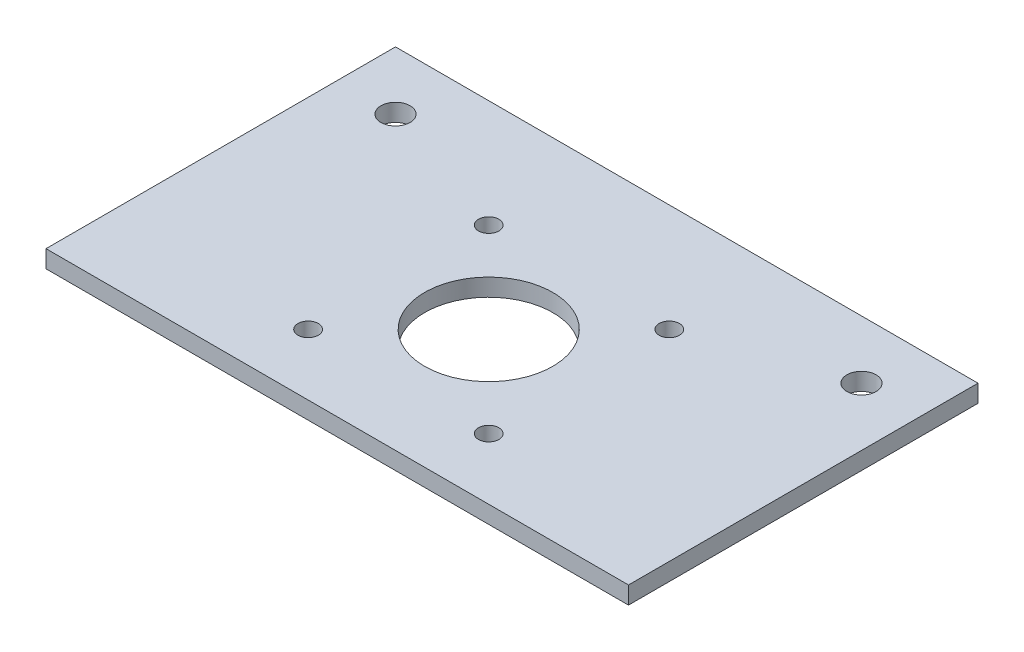
ISO-10303-21;
HEADER;
FILE_DESCRIPTION(('STEP AP214'),'2;1');
FILE_NAME('part.step','',(''),(''),'','','');
FILE_SCHEMA(('AUTOMOTIVE_DESIGN { 1 0 10303 214 1 1 1 1 }'));
ENDSEC;
DATA;
#1=APPLICATION_CONTEXT('core data for automotive mechanical design processes');
#2=APPLICATION_PROTOCOL_DEFINITION('international standard','automotive_design',2000,#1);
#3=PRODUCT_CONTEXT('',#1,'mechanical');
#4=PRODUCT('Part','Part','',(#3));
#5=PRODUCT_RELATED_PRODUCT_CATEGORY('part','',(#4));
#6=PRODUCT_DEFINITION_FORMATION('','',#4);
#7=PRODUCT_DEFINITION_CONTEXT('part definition',#1,'design');
#8=PRODUCT_DEFINITION('design','',#6,#7);
#9=PRODUCT_DEFINITION_SHAPE('','',#8);
#10=(LENGTH_UNIT() NAMED_UNIT(*) SI_UNIT(.MILLI.,.METRE.));
#11=(NAMED_UNIT(*) PLANE_ANGLE_UNIT() SI_UNIT($,.RADIAN.));
#12=(NAMED_UNIT(*) SI_UNIT($,.STERADIAN.) SOLID_ANGLE_UNIT());
#13=UNCERTAINTY_MEASURE_WITH_UNIT(LENGTH_MEASURE(1.E-05),#10,'distance_accuracy_value','');
#14=(GEOMETRIC_REPRESENTATION_CONTEXT(3) GLOBAL_UNCERTAINTY_ASSIGNED_CONTEXT((#13)) GLOBAL_UNIT_ASSIGNED_CONTEXT((#10,
#11,#12)) REPRESENTATION_CONTEXT('',''));
#15=CARTESIAN_POINT('',(0.,0.,0.));
#16=DIRECTION('',(0.,0.,1.));
#17=DIRECTION('',(1.,0.,0.));
#18=AXIS2_PLACEMENT_3D('',#15,#16,#17);
#19=CARTESIAN_POINT('',(50.,-3.,30.));
#20=DIRECTION('',(1.,0.,0.));
#21=DIRECTION('',(0.,0.,-1.));
#22=AXIS2_PLACEMENT_3D('',#19,#20,#21);
#23=PLANE('',#22);
#24=DIRECTION('',(0.,0.,-1.));
#25=VECTOR('',#24,1.);
#26=CARTESIAN_POINT('',(50.,0.,30.));
#27=LINE('',#26,#25);
#28=CARTESIAN_POINT('',(50.,0.,30.));
#29=VERTEX_POINT('',#28);
#30=CARTESIAN_POINT('',(50.,0.,-30.));
#31=VERTEX_POINT('',#30);
#32=EDGE_CURVE('E104',#29,#31,#27,.T.);
#33=ORIENTED_EDGE('',*,*,#32,.F.);
#34=DIRECTION('',(0.,1.,0.));
#35=VECTOR('',#34,1.);
#36=CARTESIAN_POINT('',(50.,-3.,30.));
#37=LINE('',#36,#35);
#38=CARTESIAN_POINT('',(50.,-3.,30.));
#39=VERTEX_POINT('',#38);
#40=EDGE_CURVE('E11',#39,#29,#37,.T.);
#41=ORIENTED_EDGE('',*,*,#40,.F.);
#42=DIRECTION('',(0.,0.,-1.));
#43=VECTOR('',#42,1.);
#44=CARTESIAN_POINT('',(50.,-3.,30.));
#45=LINE('',#44,#43);
#46=CARTESIAN_POINT('',(50.,-3.,-30.));
#47=VERTEX_POINT('',#46);
#48=EDGE_CURVE('E97',#39,#47,#45,.T.);
#49=ORIENTED_EDGE('',*,*,#48,.T.);
#50=DIRECTION('',(0.,1.,0.));
#51=VECTOR('',#50,1.);
#52=CARTESIAN_POINT('',(50.,-3.,-30.));
#53=LINE('',#52,#51);
#54=EDGE_CURVE('E42',#47,#31,#53,.T.);
#55=ORIENTED_EDGE('',*,*,#54,.T.);
#56=EDGE_LOOP('',(#33,#41,#49,#55));
#57=FACE_BOUND('',#56,.T.);
#58=ADVANCED_FACE('F39',(#57),#23,.T.);
#59=CARTESIAN_POINT('',(-50.,-3.,30.));
#60=DIRECTION('',(0.,0.,1.));
#61=DIRECTION('',(1.,0.,0.));
#62=AXIS2_PLACEMENT_3D('',#59,#60,#61);
#63=PLANE('',#62);
#64=DIRECTION('',(1.,0.,0.));
#65=VECTOR('',#64,1.);
#66=CARTESIAN_POINT('',(-50.,0.,30.));
#67=LINE('',#66,#65);
#68=CARTESIAN_POINT('',(-50.,0.,30.));
#69=VERTEX_POINT('',#68);
#70=EDGE_CURVE('E99',#69,#29,#67,.T.);
#71=ORIENTED_EDGE('',*,*,#70,.F.);
#72=DIRECTION('',(0.,1.,0.));
#73=VECTOR('',#72,1.);
#74=CARTESIAN_POINT('',(-50.,-3.,30.));
#75=LINE('',#74,#73);
#76=CARTESIAN_POINT('',(-50.,-3.,30.));
#77=VERTEX_POINT('',#76);
#78=EDGE_CURVE('E48',#77,#69,#75,.T.);
#79=ORIENTED_EDGE('',*,*,#78,.F.);
#80=DIRECTION('',(1.,0.,0.));
#81=VECTOR('',#80,1.);
#82=CARTESIAN_POINT('',(-50.,-3.,30.));
#83=LINE('',#82,#81);
#84=EDGE_CURVE('E94',#77,#39,#83,.T.);
#85=ORIENTED_EDGE('',*,*,#84,.T.);
#86=ORIENTED_EDGE('',*,*,#40,.T.);
#87=EDGE_LOOP('',(#71,#79,#85,#86));
#88=FACE_BOUND('',#87,.T.);
#89=ADVANCED_FACE('F115',(#88),#63,.T.);
#90=CARTESIAN_POINT('',(-50.,-3.,30.));
#91=DIRECTION('',(-1.,0.,0.));
#92=DIRECTION('',(0.,0.,1.));
#93=AXIS2_PLACEMENT_3D('',#90,#91,#92);
#94=PLANE('',#93);
#95=DIRECTION('',(0.,0.,1.));
#96=VECTOR('',#95,1.);
#97=CARTESIAN_POINT('',(-50.,0.,30.));
#98=LINE('',#97,#96);
#99=CARTESIAN_POINT('',(-50.,0.,-30.));
#100=VERTEX_POINT('',#99);
#101=EDGE_CURVE('E89',#100,#69,#98,.T.);
#102=ORIENTED_EDGE('',*,*,#101,.F.);
#103=DIRECTION('',(0.,1.,0.));
#104=VECTOR('',#103,1.);
#105=CARTESIAN_POINT('',(-50.,-3.,-30.));
#106=LINE('',#105,#104);
#107=CARTESIAN_POINT('',(-50.,-3.,-30.));
#108=VERTEX_POINT('',#107);
#109=EDGE_CURVE('E84',#108,#100,#106,.T.);
#110=ORIENTED_EDGE('',*,*,#109,.F.);
#111=DIRECTION('',(0.,0.,1.));
#112=VECTOR('',#111,1.);
#113=CARTESIAN_POINT('',(-50.,-3.,30.));
#114=LINE('',#113,#112);
#115=EDGE_CURVE('E87',#108,#77,#114,.T.);
#116=ORIENTED_EDGE('',*,*,#115,.T.);
#117=ORIENTED_EDGE('',*,*,#78,.T.);
#118=EDGE_LOOP('',(#102,#110,#116,#117));
#119=FACE_BOUND('',#118,.T.);
#120=ADVANCED_FACE('F86',(#119),#94,.T.);
#121=CARTESIAN_POINT('',(-50.,-3.,-30.));
#122=DIRECTION('',(0.,0.,-1.));
#123=DIRECTION('',(-1.,0.,0.));
#124=AXIS2_PLACEMENT_3D('',#121,#122,#123);
#125=PLANE('',#124);
#126=DIRECTION('',(-1.,0.,0.));
#127=VECTOR('',#126,1.);
#128=CARTESIAN_POINT('',(-50.,0.,-30.));
#129=LINE('',#128,#127);
#130=EDGE_CURVE('E107',#31,#100,#129,.T.);
#131=ORIENTED_EDGE('',*,*,#130,.F.);
#132=ORIENTED_EDGE('',*,*,#54,.F.);
#133=DIRECTION('',(-1.,0.,0.));
#134=VECTOR('',#133,1.);
#135=CARTESIAN_POINT('',(-50.,-3.,-30.));
#136=LINE('',#135,#134);
#137=EDGE_CURVE('E93',#47,#108,#136,.T.);
#138=ORIENTED_EDGE('',*,*,#137,.T.);
#139=ORIENTED_EDGE('',*,*,#109,.T.);
#140=EDGE_LOOP('',(#131,#132,#138,#139));
#141=FACE_BOUND('',#140,.T.);
#142=ADVANCED_FACE('F96',(#141),#125,.T.);
#143=CARTESIAN_POINT('',(0.,-3.,0.));
#144=DIRECTION('',(0.,-1.,0.));
#145=DIRECTION('',(0.,0.,-1.));
#146=AXIS2_PLACEMENT_3D('',#143,#144,#145);
#147=PLANE('',#146);
#148=CARTESIAN_POINT('',(40.,-3.,-20.));
#149=DIRECTION('',(0.,1.,0.));
#150=DIRECTION('',(0.,0.,1.));
#151=AXIS2_PLACEMENT_3D('',#148,#149,#150);
#152=CIRCLE('',#151,2.5);
#153=CARTESIAN_POINT('',(40.,-3.,-17.5));
#154=VERTEX_POINT('',#153);
#155=EDGE_CURVE('E108',#154,#154,#152,.T.);
#156=ORIENTED_EDGE('',*,*,#155,.T.);
#157=EDGE_LOOP('',(#156));
#158=FACE_BOUND('',#157,.T.);
#159=CARTESIAN_POINT('',(-15.5,-3.,-11.5));
#160=DIRECTION('',(0.,1.,0.));
#161=DIRECTION('',(0.,0.,-1.));
#162=AXIS2_PLACEMENT_3D('',#159,#160,#161);
#163=CIRCLE('',#162,1.75);
#164=CARTESIAN_POINT('',(-15.5,-3.,-13.25));
#165=VERTEX_POINT('',#164);
#166=EDGE_CURVE('E185',#165,#165,#163,.T.);
#167=ORIENTED_EDGE('',*,*,#166,.T.);
#168=EDGE_LOOP('',(#167));
#169=FACE_BOUND('',#168,.T.);
#170=CARTESIAN_POINT('',(-15.5,-3.,19.5));
#171=DIRECTION('',(0.,1.,0.));
#172=DIRECTION('',(0.,0.,1.));
#173=AXIS2_PLACEMENT_3D('',#170,#171,#172);
#174=CIRCLE('',#173,1.75000000000006);
#175=CARTESIAN_POINT('',(-15.5,-3.,21.2500000000001));
#176=VERTEX_POINT('',#175);
#177=EDGE_CURVE('E178',#176,#176,#174,.T.);
#178=ORIENTED_EDGE('',*,*,#177,.T.);
#179=EDGE_LOOP('',(#178));
#180=FACE_BOUND('',#179,.T.);
#181=CARTESIAN_POINT('',(15.5,-3.,19.5));
#182=DIRECTION('',(0.,1.,0.));
#183=DIRECTION('',(0.,0.,-1.));
#184=AXIS2_PLACEMENT_3D('',#181,#182,#183);
#185=CIRCLE('',#184,1.75);
#186=CARTESIAN_POINT('',(15.5,-3.,17.75));
#187=VERTEX_POINT('',#186);
#188=EDGE_CURVE('E205',#187,#187,#185,.T.);
#189=ORIENTED_EDGE('',*,*,#188,.T.);
#190=EDGE_LOOP('',(#189));
#191=FACE_BOUND('',#190,.T.);
#192=CARTESIAN_POINT('',(15.5,-3.,-11.5));
#193=DIRECTION('',(0.,1.,0.));
#194=DIRECTION('',(0.,0.,1.));
#195=AXIS2_PLACEMENT_3D('',#192,#193,#194);
#196=CIRCLE('',#195,1.75);
#197=CARTESIAN_POINT('',(15.5,-3.,-9.74999999999999));
#198=VERTEX_POINT('',#197);
#199=EDGE_CURVE('E199',#198,#198,#196,.T.);
#200=ORIENTED_EDGE('',*,*,#199,.T.);
#201=EDGE_LOOP('',(#200));
#202=FACE_BOUND('',#201,.T.);
#203=CARTESIAN_POINT('',(0.,-3.,4.00000000000001));
#204=DIRECTION('',(0.,1.,0.));
#205=DIRECTION('',(0.,0.,1.));
#206=AXIS2_PLACEMENT_3D('',#203,#204,#205);
#207=CIRCLE('',#206,11.);
#208=CARTESIAN_POINT('',(0.,-3.,15.));
#209=VERTEX_POINT('',#208);
#210=EDGE_CURVE('E193',#209,#209,#207,.T.);
#211=ORIENTED_EDGE('',*,*,#210,.T.);
#212=EDGE_LOOP('',(#211));
#213=FACE_BOUND('',#212,.T.);
#214=CARTESIAN_POINT('',(-40.,-3.,-20.));
#215=DIRECTION('',(0.,1.,0.));
#216=DIRECTION('',(0.,0.,-1.));
#217=AXIS2_PLACEMENT_3D('',#214,#215,#216);
#218=CIRCLE('',#217,2.5);
#219=CARTESIAN_POINT('',(-40.,-3.,-22.5));
#220=VERTEX_POINT('',#219);
#221=EDGE_CURVE('E171',#220,#220,#218,.T.);
#222=ORIENTED_EDGE('',*,*,#221,.T.);
#223=EDGE_LOOP('',(#222));
#224=FACE_BOUND('',#223,.T.);
#225=ORIENTED_EDGE('',*,*,#48,.F.);
#226=ORIENTED_EDGE('',*,*,#84,.F.);
#227=ORIENTED_EDGE('',*,*,#115,.F.);
#228=ORIENTED_EDGE('',*,*,#137,.F.);
#229=EDGE_LOOP('',(#225,#226,#227,#228));
#230=FACE_BOUND('',#229,.T.);
#231=ADVANCED_FACE('F92',(#158,#169,#180,#191,#202,#213,#224,#230),#147,.T.);
#232=CARTESIAN_POINT('',(0.,0.,0.));
#233=DIRECTION('',(0.,-1.,0.));
#234=DIRECTION('',(0.,0.,-1.));
#235=AXIS2_PLACEMENT_3D('',#232,#233,#234);
#236=PLANE('',#235);
#237=CARTESIAN_POINT('',(40.,0.,-20.));
#238=DIRECTION('',(0.,1.,0.));
#239=DIRECTION('',(0.,0.,1.));
#240=AXIS2_PLACEMENT_3D('',#237,#238,#239);
#241=CIRCLE('',#240,2.5);
#242=CARTESIAN_POINT('',(40.,0.,-17.5));
#243=VERTEX_POINT('',#242);
#244=EDGE_CURVE('E170',#243,#243,#241,.T.);
#245=ORIENTED_EDGE('',*,*,#244,.F.);
#246=EDGE_LOOP('',(#245));
#247=FACE_BOUND('',#246,.T.);
#248=CARTESIAN_POINT('',(-15.5,0.,-11.5));
#249=DIRECTION('',(0.,1.,0.));
#250=DIRECTION('',(0.,0.,-1.));
#251=AXIS2_PLACEMENT_3D('',#248,#249,#250);
#252=CIRCLE('',#251,1.75);
#253=CARTESIAN_POINT('',(-15.5,0.,-13.25));
#254=VERTEX_POINT('',#253);
#255=EDGE_CURVE('E188',#254,#254,#252,.T.);
#256=ORIENTED_EDGE('',*,*,#255,.F.);
#257=EDGE_LOOP('',(#256));
#258=FACE_BOUND('',#257,.T.);
#259=CARTESIAN_POINT('',(-15.5,0.,19.5));
#260=DIRECTION('',(0.,1.,0.));
#261=DIRECTION('',(0.,0.,1.));
#262=AXIS2_PLACEMENT_3D('',#259,#260,#261);
#263=CIRCLE('',#262,1.75000000000006);
#264=CARTESIAN_POINT('',(-15.5,0.,21.2500000000001));
#265=VERTEX_POINT('',#264);
#266=EDGE_CURVE('E182',#265,#265,#263,.T.);
#267=ORIENTED_EDGE('',*,*,#266,.F.);
#268=EDGE_LOOP('',(#267));
#269=FACE_BOUND('',#268,.T.);
#270=CARTESIAN_POINT('',(15.5,0.,19.5));
#271=DIRECTION('',(0.,1.,0.));
#272=DIRECTION('',(0.,0.,-1.));
#273=AXIS2_PLACEMENT_3D('',#270,#271,#272);
#274=CIRCLE('',#273,1.75);
#275=CARTESIAN_POINT('',(15.5,0.,17.75));
#276=VERTEX_POINT('',#275);
#277=EDGE_CURVE('E181',#276,#276,#274,.T.);
#278=ORIENTED_EDGE('',*,*,#277,.F.);
#279=EDGE_LOOP('',(#278));
#280=FACE_BOUND('',#279,.T.);
#281=CARTESIAN_POINT('',(15.5,0.,-11.5));
#282=DIRECTION('',(0.,1.,0.));
#283=DIRECTION('',(0.,0.,1.));
#284=AXIS2_PLACEMENT_3D('',#281,#282,#283);
#285=CIRCLE('',#284,1.75);
#286=CARTESIAN_POINT('',(15.5,0.,-9.74999999999999));
#287=VERTEX_POINT('',#286);
#288=EDGE_CURVE('E202',#287,#287,#285,.T.);
#289=ORIENTED_EDGE('',*,*,#288,.F.);
#290=EDGE_LOOP('',(#289));
#291=FACE_BOUND('',#290,.T.);
#292=CARTESIAN_POINT('',(0.,0.,4.00000000000001));
#293=DIRECTION('',(0.,1.,0.));
#294=DIRECTION('',(0.,0.,1.));
#295=AXIS2_PLACEMENT_3D('',#292,#293,#294);
#296=CIRCLE('',#295,11.);
#297=CARTESIAN_POINT('',(0.,0.,15.));
#298=VERTEX_POINT('',#297);
#299=EDGE_CURVE('E196',#298,#298,#296,.T.);
#300=ORIENTED_EDGE('',*,*,#299,.F.);
#301=EDGE_LOOP('',(#300));
#302=FACE_BOUND('',#301,.T.);
#303=CARTESIAN_POINT('',(-40.,0.,-20.));
#304=DIRECTION('',(0.,1.,0.));
#305=DIRECTION('',(0.,0.,-1.));
#306=AXIS2_PLACEMENT_3D('',#303,#304,#305);
#307=CIRCLE('',#306,2.5);
#308=CARTESIAN_POINT('',(-40.,0.,-22.5));
#309=VERTEX_POINT('',#308);
#310=EDGE_CURVE('E175',#309,#309,#307,.T.);
#311=ORIENTED_EDGE('',*,*,#310,.F.);
#312=EDGE_LOOP('',(#311));
#313=FACE_BOUND('',#312,.T.);
#314=ORIENTED_EDGE('',*,*,#32,.T.);
#315=ORIENTED_EDGE('',*,*,#130,.T.);
#316=ORIENTED_EDGE('',*,*,#101,.T.);
#317=ORIENTED_EDGE('',*,*,#70,.T.);
#318=EDGE_LOOP('',(#314,#315,#316,#317));
#319=FACE_BOUND('',#318,.T.);
#320=ADVANCED_FACE('F114',(#247,#258,#269,#280,#291,#302,#313,#319),#236,.F.);
#321=CARTESIAN_POINT('',(-40.,-3.,-20.));
#322=DIRECTION('',(0.,1.,0.));
#323=DIRECTION('',(0.,0.,1.));
#324=AXIS2_PLACEMENT_3D('',#321,#322,#323);
#325=CYLINDRICAL_SURFACE('',#324,2.5);
#326=ORIENTED_EDGE('',*,*,#221,.F.);
#327=EDGE_LOOP('',(#326));
#328=FACE_BOUND('',#327,.T.);
#329=ORIENTED_EDGE('',*,*,#310,.T.);
#330=EDGE_LOOP('',(#329));
#331=FACE_BOUND('',#330,.T.);
#332=ADVANCED_FACE('F133',(#328,#331),#325,.F.);
#333=CARTESIAN_POINT('',(0.,-3.,4.00000000000001));
#334=DIRECTION('',(0.,1.,0.));
#335=DIRECTION('',(0.,0.,1.));
#336=AXIS2_PLACEMENT_3D('',#333,#334,#335);
#337=CYLINDRICAL_SURFACE('',#336,11.);
#338=ORIENTED_EDGE('',*,*,#210,.F.);
#339=EDGE_LOOP('',(#338));
#340=FACE_BOUND('',#339,.T.);
#341=ORIENTED_EDGE('',*,*,#299,.T.);
#342=EDGE_LOOP('',(#341));
#343=FACE_BOUND('',#342,.T.);
#344=ADVANCED_FACE('F146',(#340,#343),#337,.F.);
#345=CARTESIAN_POINT('',(15.5,-3.,-11.5));
#346=DIRECTION('',(0.,1.,0.));
#347=DIRECTION('',(0.,0.,1.));
#348=AXIS2_PLACEMENT_3D('',#345,#346,#347);
#349=CYLINDRICAL_SURFACE('',#348,1.75);
#350=ORIENTED_EDGE('',*,*,#199,.F.);
#351=EDGE_LOOP('',(#350));
#352=FACE_BOUND('',#351,.T.);
#353=ORIENTED_EDGE('',*,*,#288,.T.);
#354=EDGE_LOOP('',(#353));
#355=FACE_BOUND('',#354,.T.);
#356=ADVANCED_FACE('F142',(#352,#355),#349,.F.);
#357=CARTESIAN_POINT('',(15.5,-3.,19.5));
#358=DIRECTION('',(0.,1.,0.));
#359=DIRECTION('',(0.,0.,1.));
#360=AXIS2_PLACEMENT_3D('',#357,#358,#359);
#361=CYLINDRICAL_SURFACE('',#360,1.75);
#362=ORIENTED_EDGE('',*,*,#188,.F.);
#363=EDGE_LOOP('',(#362));
#364=FACE_BOUND('',#363,.T.);
#365=ORIENTED_EDGE('',*,*,#277,.T.);
#366=EDGE_LOOP('',(#365));
#367=FACE_BOUND('',#366,.T.);
#368=ADVANCED_FACE('F138',(#364,#367),#361,.F.);
#369=CARTESIAN_POINT('',(-15.5,-3.,19.5));
#370=DIRECTION('',(0.,1.,0.));
#371=DIRECTION('',(0.,0.,1.));
#372=AXIS2_PLACEMENT_3D('',#369,#370,#371);
#373=CYLINDRICAL_SURFACE('',#372,1.75000000000006);
#374=ORIENTED_EDGE('',*,*,#177,.F.);
#375=EDGE_LOOP('',(#374));
#376=FACE_BOUND('',#375,.T.);
#377=ORIENTED_EDGE('',*,*,#266,.T.);
#378=EDGE_LOOP('',(#377));
#379=FACE_BOUND('',#378,.T.);
#380=ADVANCED_FACE('F141',(#376,#379),#373,.F.);
#381=CARTESIAN_POINT('',(-15.5,-3.,-11.5));
#382=DIRECTION('',(0.,1.,0.));
#383=DIRECTION('',(0.,0.,1.));
#384=AXIS2_PLACEMENT_3D('',#381,#382,#383);
#385=CYLINDRICAL_SURFACE('',#384,1.75);
#386=ORIENTED_EDGE('',*,*,#166,.F.);
#387=EDGE_LOOP('',(#386));
#388=FACE_BOUND('',#387,.T.);
#389=ORIENTED_EDGE('',*,*,#255,.T.);
#390=EDGE_LOOP('',(#389));
#391=FACE_BOUND('',#390,.T.);
#392=ADVANCED_FACE('F154',(#388,#391),#385,.F.);
#393=CARTESIAN_POINT('',(40.,-3.,-20.));
#394=DIRECTION('',(0.,1.,0.));
#395=DIRECTION('',(0.,0.,1.));
#396=AXIS2_PLACEMENT_3D('',#393,#394,#395);
#397=CYLINDRICAL_SURFACE('',#396,2.5);
#398=ORIENTED_EDGE('',*,*,#155,.F.);
#399=EDGE_LOOP('',(#398));
#400=FACE_BOUND('',#399,.T.);
#401=ORIENTED_EDGE('',*,*,#244,.T.);
#402=EDGE_LOOP('',(#401));
#403=FACE_BOUND('',#402,.T.);
#404=ADVANCED_FACE('F157',(#400,#403),#397,.F.);
#405=CLOSED_SHELL('',(#58,#89,#120,#142,#231,#320,#332,#344,#356,#368,#380,#392,#404));
#406=MANIFOLD_SOLID_BREP('B2',#405);
#407=ADVANCED_BREP_SHAPE_REPRESENTATION('',(#18,#406),#14);
#408=SHAPE_DEFINITION_REPRESENTATION(#9,#407);
ENDSEC;
END-ISO-10303-21;
